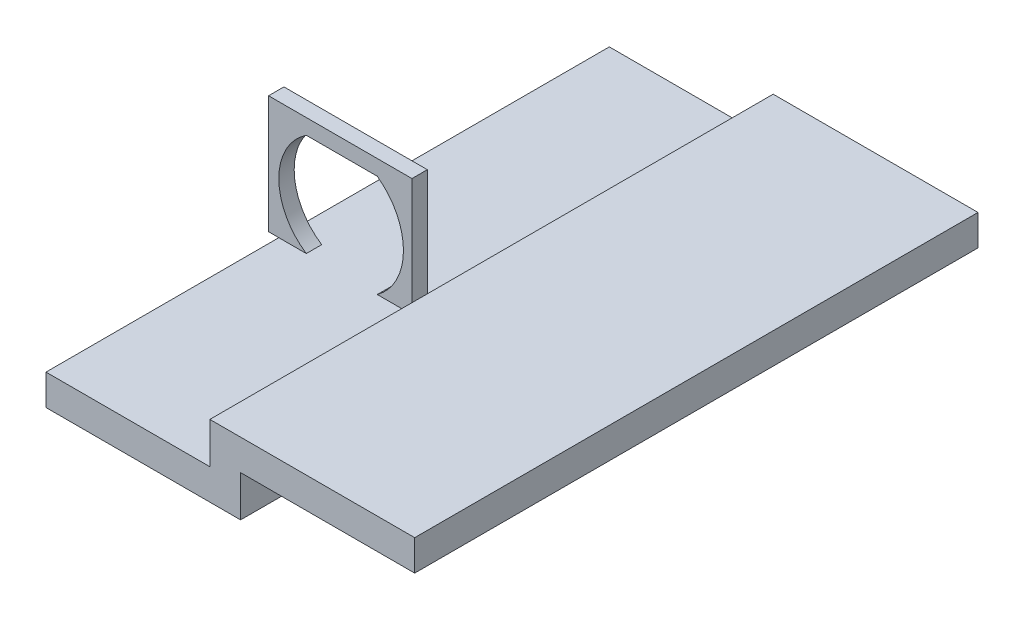
ISO-10303-21;
HEADER;
FILE_DESCRIPTION(('STEP AP214'),'2;1');
FILE_NAME('part.step','',(''),(''),'','','');
FILE_SCHEMA(('AUTOMOTIVE_DESIGN { 1 0 10303 214 1 1 1 1 }'));
ENDSEC;
DATA;
#1=APPLICATION_CONTEXT('core data for automotive mechanical design processes');
#2=APPLICATION_PROTOCOL_DEFINITION('international standard','automotive_design',2000,#1);
#3=PRODUCT_CONTEXT('',#1,'mechanical');
#4=PRODUCT('Part','Part','',(#3));
#5=PRODUCT_RELATED_PRODUCT_CATEGORY('part','',(#4));
#6=PRODUCT_DEFINITION_FORMATION('','',#4);
#7=PRODUCT_DEFINITION_CONTEXT('part definition',#1,'design');
#8=PRODUCT_DEFINITION('design','',#6,#7);
#9=PRODUCT_DEFINITION_SHAPE('','',#8);
#10=(LENGTH_UNIT() NAMED_UNIT(*) SI_UNIT(.MILLI.,.METRE.));
#11=(NAMED_UNIT(*) PLANE_ANGLE_UNIT() SI_UNIT($,.RADIAN.));
#12=(NAMED_UNIT(*) SI_UNIT($,.STERADIAN.) SOLID_ANGLE_UNIT());
#13=UNCERTAINTY_MEASURE_WITH_UNIT(LENGTH_MEASURE(1.E-05),#10,'distance_accuracy_value','');
#14=(GEOMETRIC_REPRESENTATION_CONTEXT(3) GLOBAL_UNCERTAINTY_ASSIGNED_CONTEXT((#13)) GLOBAL_UNIT_ASSIGNED_CONTEXT((#10,
#11,#12)) REPRESENTATION_CONTEXT('',''));
#15=CARTESIAN_POINT('',(0.,0.,0.));
#16=DIRECTION('',(0.,0.,1.));
#17=DIRECTION('',(1.,0.,0.));
#18=AXIS2_PLACEMENT_3D('',#15,#16,#17);
#19=CARTESIAN_POINT('',(-3.,3.,55.));
#20=DIRECTION('',(0.,-1.,0.));
#21=DIRECTION('',(1.,0.,0.));
#22=AXIS2_PLACEMENT_3D('',#19,#20,#21);
#23=PLANE('',#22);
#24=DIRECTION('',(0.,0.,1.));
#25=VECTOR('',#24,1.);
#26=CARTESIAN_POINT('',(-9.38702330984164,2.99999999999999,20.7679651385859));
#27=LINE('',#26,#25);
#28=CARTESIAN_POINT('',(-9.38702330984164,2.99999999999999,30.7679651385859));
#29=VERTEX_POINT('',#28);
#30=CARTESIAN_POINT('',(-9.38702330984164,2.99999999999999,32.2679651385859));
#31=VERTEX_POINT('',#30);
#32=EDGE_CURVE('E172',#29,#31,#27,.T.);
#33=ORIENTED_EDGE('',*,*,#32,.F.);
#34=DIRECTION('',(-1.,0.,0.));
#35=VECTOR('',#34,1.);
#36=CARTESIAN_POINT('',(-6.,3.,30.7679651385859));
#37=LINE('',#36,#35);
#38=CARTESIAN_POINT('',(-6.,3.,30.7679651385859));
#39=VERTEX_POINT('',#38);
#40=EDGE_CURVE('E193',#39,#29,#37,.T.);
#41=ORIENTED_EDGE('',*,*,#40,.F.);
#42=DIRECTION('',(0.,0.,-1.));
#43=VECTOR('',#42,1.);
#44=CARTESIAN_POINT('',(-6.,3.,32.2679651385859));
#45=LINE('',#44,#43);
#46=CARTESIAN_POINT('',(-6.,3.,32.2679651385859));
#47=VERTEX_POINT('',#46);
#48=EDGE_CURVE('E186',#47,#39,#45,.T.);
#49=ORIENTED_EDGE('',*,*,#48,.F.);
#50=DIRECTION('',(1.,0.,0.));
#51=VECTOR('',#50,1.);
#52=CARTESIAN_POINT('',(-3.,3.,32.2679651385859));
#53=LINE('',#52,#51);
#54=EDGE_CURVE('E41',#31,#47,#53,.T.);
#55=ORIENTED_EDGE('',*,*,#54,.F.);
#56=EDGE_LOOP('',(#33,#41,#49,#55));
#57=FACE_BOUND('',#56,.T.);
#58=CARTESIAN_POINT('',(-16.3166247903554,2.99999999999999,30.7679651385859));
#59=VERTEX_POINT('',#58);
#60=CARTESIAN_POINT('',(-19.,2.99999999999999,30.7679651385859));
#61=VERTEX_POINT('',#60);
#62=EDGE_CURVE('E197',#59,#61,#37,.T.);
#63=ORIENTED_EDGE('',*,*,#62,.F.);
#64=DIRECTION('',(0.,0.,1.));
#65=VECTOR('',#64,1.);
#66=CARTESIAN_POINT('',(-16.3166247903554,2.99999999999999,20.7679651385859));
#67=LINE('',#66,#65);
#68=CARTESIAN_POINT('',(-16.3166247903554,2.99999999999999,32.2679651385859));
#69=VERTEX_POINT('',#68);
#70=EDGE_CURVE('E158',#59,#69,#67,.T.);
#71=ORIENTED_EDGE('',*,*,#70,.T.);
#72=CARTESIAN_POINT('',(-19.,2.99999999999999,32.2679651385859));
#73=VERTEX_POINT('',#72);
#74=EDGE_CURVE('E11',#73,#69,#53,.T.);
#75=ORIENTED_EDGE('',*,*,#74,.F.);
#76=DIRECTION('',(0.,0.,-1.));
#77=VECTOR('',#76,1.);
#78=CARTESIAN_POINT('',(-19.,2.99999999999999,55.));
#79=LINE('',#78,#77);
#80=CARTESIAN_POINT('',(-19.,2.99999999999999,55.));
#81=VERTEX_POINT('',#80);
#82=EDGE_CURVE('E250',#81,#73,#79,.T.);
#83=ORIENTED_EDGE('',*,*,#82,.F.);
#84=DIRECTION('',(-1.,0.,0.));
#85=VECTOR('',#84,1.);
#86=CARTESIAN_POINT('',(-3.,3.,55.));
#87=LINE('',#86,#85);
#88=CARTESIAN_POINT('',(-3.,3.,55.));
#89=VERTEX_POINT('',#88);
#90=EDGE_CURVE('E231',#89,#81,#87,.T.);
#91=ORIENTED_EDGE('',*,*,#90,.F.);
#92=DIRECTION('',(0.,0.,-1.));
#93=VECTOR('',#92,1.);
#94=CARTESIAN_POINT('',(-3.,3.,55.));
#95=LINE('',#94,#93);
#96=CARTESIAN_POINT('',(-3.,3.,0.));
#97=VERTEX_POINT('',#96);
#98=EDGE_CURVE('E253',#89,#97,#95,.T.);
#99=ORIENTED_EDGE('',*,*,#98,.T.);
#100=DIRECTION('',(-1.,0.,0.));
#101=VECTOR('',#100,1.);
#102=CARTESIAN_POINT('',(-3.,3.,0.));
#103=LINE('',#102,#101);
#104=CARTESIAN_POINT('',(-19.,2.99999999999999,0.));
#105=VERTEX_POINT('',#104);
#106=EDGE_CURVE('E219',#97,#105,#103,.T.);
#107=ORIENTED_EDGE('',*,*,#106,.T.);
#108=EDGE_CURVE('E233',#61,#105,#79,.T.);
#109=ORIENTED_EDGE('',*,*,#108,.F.);
#110=EDGE_LOOP('',(#63,#71,#75,#83,#91,#99,#107,#109));
#111=FACE_BOUND('',#110,.T.);
#112=ADVANCED_FACE('F33',(#57,#111),#23,.F.);
#113=CARTESIAN_POINT('',(-19.,2.99999999999999,55.));
#114=DIRECTION('',(1.,0.,0.));
#115=DIRECTION('',(0.,0.,-1.));
#116=AXIS2_PLACEMENT_3D('',#113,#114,#115);
#117=PLANE('',#116);
#118=DIRECTION('',(0.,-1.,0.));
#119=VECTOR('',#118,1.);
#120=CARTESIAN_POINT('',(-19.,2.99999999999999,0.));
#121=LINE('',#120,#119);
#122=CARTESIAN_POINT('',(-19.,0.,0.));
#123=VERTEX_POINT('',#122);
#124=EDGE_CURVE('E214',#105,#123,#121,.T.);
#125=ORIENTED_EDGE('',*,*,#124,.T.);
#126=DIRECTION('',(0.,0.,-1.));
#127=VECTOR('',#126,1.);
#128=CARTESIAN_POINT('',(-19.,0.,55.));
#129=LINE('',#128,#127);
#130=CARTESIAN_POINT('',(-19.,0.,55.));
#131=VERTEX_POINT('',#130);
#132=EDGE_CURVE('E271',#131,#123,#129,.T.);
#133=ORIENTED_EDGE('',*,*,#132,.F.);
#134=DIRECTION('',(0.,-1.,0.));
#135=VECTOR('',#134,1.);
#136=CARTESIAN_POINT('',(-19.,2.99999999999999,55.));
#137=LINE('',#136,#135);
#138=EDGE_CURVE('E215',#81,#131,#137,.T.);
#139=ORIENTED_EDGE('',*,*,#138,.F.);
#140=ORIENTED_EDGE('',*,*,#82,.T.);
#141=EDGE_CURVE('E254',#73,#61,#79,.T.);
#142=ORIENTED_EDGE('',*,*,#141,.T.);
#143=ORIENTED_EDGE('',*,*,#108,.T.);
#144=EDGE_LOOP('',(#125,#133,#139,#140,#142,#143));
#145=FACE_BOUND('',#144,.T.);
#146=ADVANCED_FACE('F35',(#145),#117,.F.);
#147=CARTESIAN_POINT('',(-19.,0.,55.));
#148=DIRECTION('',(0.,1.,0.));
#149=DIRECTION('',(-1.,0.,0.));
#150=AXIS2_PLACEMENT_3D('',#147,#148,#149);
#151=PLANE('',#150);
#152=DIRECTION('',(1.,0.,0.));
#153=VECTOR('',#152,1.);
#154=CARTESIAN_POINT('',(-19.,0.,0.));
#155=LINE('',#154,#153);
#156=CARTESIAN_POINT('',(0.,0.,0.));
#157=VERTEX_POINT('',#156);
#158=EDGE_CURVE('E236',#123,#157,#155,.T.);
#159=ORIENTED_EDGE('',*,*,#158,.T.);
#160=DIRECTION('',(0.,0.,-1.));
#161=VECTOR('',#160,1.);
#162=CARTESIAN_POINT('',(0.,0.,55.));
#163=LINE('',#162,#161);
#164=CARTESIAN_POINT('',(0.,0.,55.));
#165=VERTEX_POINT('',#164);
#166=EDGE_CURVE('E269',#165,#157,#163,.T.);
#167=ORIENTED_EDGE('',*,*,#166,.F.);
#168=DIRECTION('',(1.,0.,0.));
#169=VECTOR('',#168,1.);
#170=CARTESIAN_POINT('',(-19.,0.,55.));
#171=LINE('',#170,#169);
#172=EDGE_CURVE('E218',#131,#165,#171,.T.);
#173=ORIENTED_EDGE('',*,*,#172,.F.);
#174=ORIENTED_EDGE('',*,*,#132,.T.);
#175=EDGE_LOOP('',(#159,#167,#173,#174));
#176=FACE_BOUND('',#175,.T.);
#177=ADVANCED_FACE('F312',(#176),#151,.F.);
#178=CARTESIAN_POINT('',(0.,0.,55.));
#179=DIRECTION('',(-1.,0.,0.));
#180=DIRECTION('',(0.,0.,1.));
#181=AXIS2_PLACEMENT_3D('',#178,#179,#180);
#182=PLANE('',#181);
#183=DIRECTION('',(0.,1.,0.));
#184=VECTOR('',#183,1.);
#185=CARTESIAN_POINT('',(0.,0.,0.));
#186=LINE('',#185,#184);
#187=CARTESIAN_POINT('',(0.,4.,0.));
#188=VERTEX_POINT('',#187);
#189=EDGE_CURVE('E238',#157,#188,#186,.T.);
#190=ORIENTED_EDGE('',*,*,#189,.T.);
#191=DIRECTION('',(0.,0.,-1.));
#192=VECTOR('',#191,1.);
#193=CARTESIAN_POINT('',(0.,4.,55.));
#194=LINE('',#193,#192);
#195=CARTESIAN_POINT('',(0.,4.,55.));
#196=VERTEX_POINT('',#195);
#197=EDGE_CURVE('E266',#196,#188,#194,.T.);
#198=ORIENTED_EDGE('',*,*,#197,.F.);
#199=DIRECTION('',(0.,1.,0.));
#200=VECTOR('',#199,1.);
#201=CARTESIAN_POINT('',(0.,0.,55.));
#202=LINE('',#201,#200);
#203=EDGE_CURVE('E221',#165,#196,#202,.T.);
#204=ORIENTED_EDGE('',*,*,#203,.F.);
#205=ORIENTED_EDGE('',*,*,#166,.T.);
#206=EDGE_LOOP('',(#190,#198,#204,#205));
#207=FACE_BOUND('',#206,.T.);
#208=ADVANCED_FACE('F315',(#207),#182,.F.);
#209=CARTESIAN_POINT('',(0.,4.,55.));
#210=DIRECTION('',(0.,1.,0.));
#211=DIRECTION('',(0.,0.,1.));
#212=AXIS2_PLACEMENT_3D('',#209,#210,#211);
#213=PLANE('',#212);
#214=DIRECTION('',(1.,0.,0.));
#215=VECTOR('',#214,1.);
#216=CARTESIAN_POINT('',(0.,4.,0.));
#217=LINE('',#216,#215);
#218=CARTESIAN_POINT('',(17.,4.,0.));
#219=VERTEX_POINT('',#218);
#220=EDGE_CURVE('E240',#188,#219,#217,.T.);
#221=ORIENTED_EDGE('',*,*,#220,.T.);
#222=DIRECTION('',(0.,0.,-1.));
#223=VECTOR('',#222,1.);
#224=CARTESIAN_POINT('',(17.,4.,55.));
#225=LINE('',#224,#223);
#226=CARTESIAN_POINT('',(17.,4.,55.));
#227=VERTEX_POINT('',#226);
#228=EDGE_CURVE('E263',#227,#219,#225,.T.);
#229=ORIENTED_EDGE('',*,*,#228,.F.);
#230=DIRECTION('',(1.,0.,0.));
#231=VECTOR('',#230,1.);
#232=CARTESIAN_POINT('',(0.,4.,55.));
#233=LINE('',#232,#231);
#234=EDGE_CURVE('E223',#196,#227,#233,.T.);
#235=ORIENTED_EDGE('',*,*,#234,.F.);
#236=ORIENTED_EDGE('',*,*,#197,.T.);
#237=EDGE_LOOP('',(#221,#229,#235,#236));
#238=FACE_BOUND('',#237,.T.);
#239=ADVANCED_FACE('F356',(#238),#213,.F.);
#240=CARTESIAN_POINT('',(17.,4.,55.));
#241=DIRECTION('',(-1.,0.,0.));
#242=DIRECTION('',(0.,0.,1.));
#243=AXIS2_PLACEMENT_3D('',#240,#241,#242);
#244=PLANE('',#243);
#245=DIRECTION('',(0.,1.,0.));
#246=VECTOR('',#245,1.);
#247=CARTESIAN_POINT('',(17.,4.,0.));
#248=LINE('',#247,#246);
#249=CARTESIAN_POINT('',(17.,7.,0.));
#250=VERTEX_POINT('',#249);
#251=EDGE_CURVE('E242',#219,#250,#248,.T.);
#252=ORIENTED_EDGE('',*,*,#251,.T.);
#253=DIRECTION('',(0.,0.,-1.));
#254=VECTOR('',#253,1.);
#255=CARTESIAN_POINT('',(17.,7.,55.));
#256=LINE('',#255,#254);
#257=CARTESIAN_POINT('',(17.,7.,55.));
#258=VERTEX_POINT('',#257);
#259=EDGE_CURVE('E260',#258,#250,#256,.T.);
#260=ORIENTED_EDGE('',*,*,#259,.F.);
#261=DIRECTION('',(0.,1.,0.));
#262=VECTOR('',#261,1.);
#263=CARTESIAN_POINT('',(17.,4.,55.));
#264=LINE('',#263,#262);
#265=EDGE_CURVE('E225',#227,#258,#264,.T.);
#266=ORIENTED_EDGE('',*,*,#265,.F.);
#267=ORIENTED_EDGE('',*,*,#228,.T.);
#268=EDGE_LOOP('',(#252,#260,#266,#267));
#269=FACE_BOUND('',#268,.T.);
#270=ADVANCED_FACE('F352',(#269),#244,.F.);
#271=CARTESIAN_POINT('',(17.,7.,55.));
#272=DIRECTION('',(0.,-1.,0.));
#273=DIRECTION('',(1.,0.,0.));
#274=AXIS2_PLACEMENT_3D('',#271,#272,#273);
#275=PLANE('',#274);
#276=DIRECTION('',(-1.,0.,0.));
#277=VECTOR('',#276,1.);
#278=CARTESIAN_POINT('',(17.,7.,0.));
#279=LINE('',#278,#277);
#280=CARTESIAN_POINT('',(-3.,7.,0.));
#281=VERTEX_POINT('',#280);
#282=EDGE_CURVE('E244',#250,#281,#279,.T.);
#283=ORIENTED_EDGE('',*,*,#282,.T.);
#284=DIRECTION('',(0.,0.,-1.));
#285=VECTOR('',#284,1.);
#286=CARTESIAN_POINT('',(-3.,7.,55.));
#287=LINE('',#286,#285);
#288=CARTESIAN_POINT('',(-3.,7.,55.));
#289=VERTEX_POINT('',#288);
#290=EDGE_CURVE('E257',#289,#281,#287,.T.);
#291=ORIENTED_EDGE('',*,*,#290,.F.);
#292=DIRECTION('',(-1.,0.,0.));
#293=VECTOR('',#292,1.);
#294=CARTESIAN_POINT('',(17.,7.,55.));
#295=LINE('',#294,#293);
#296=EDGE_CURVE('E227',#258,#289,#295,.T.);
#297=ORIENTED_EDGE('',*,*,#296,.F.);
#298=ORIENTED_EDGE('',*,*,#259,.T.);
#299=EDGE_LOOP('',(#283,#291,#297,#298));
#300=FACE_BOUND('',#299,.T.);
#301=ADVANCED_FACE('F348',(#300),#275,.F.);
#302=CARTESIAN_POINT('',(-3.,7.,55.));
#303=DIRECTION('',(1.,0.,0.));
#304=DIRECTION('',(0.,1.,0.));
#305=AXIS2_PLACEMENT_3D('',#302,#303,#304);
#306=PLANE('',#305);
#307=DIRECTION('',(0.,-1.,0.));
#308=VECTOR('',#307,1.);
#309=CARTESIAN_POINT('',(-3.,7.,0.));
#310=LINE('',#309,#308);
#311=EDGE_CURVE('E246',#281,#97,#310,.T.);
#312=ORIENTED_EDGE('',*,*,#311,.T.);
#313=ORIENTED_EDGE('',*,*,#98,.F.);
#314=DIRECTION('',(0.,-1.,0.));
#315=VECTOR('',#314,1.);
#316=CARTESIAN_POINT('',(-3.,7.,55.));
#317=LINE('',#316,#315);
#318=EDGE_CURVE('E229',#289,#89,#317,.T.);
#319=ORIENTED_EDGE('',*,*,#318,.F.);
#320=ORIENTED_EDGE('',*,*,#290,.T.);
#321=EDGE_LOOP('',(#312,#313,#319,#320));
#322=FACE_BOUND('',#321,.T.);
#323=ADVANCED_FACE('F345',(#322),#306,.F.);
#324=CARTESIAN_POINT('',(0.,0.,55.));
#325=DIRECTION('',(0.,0.,1.));
#326=DIRECTION('',(1.,0.,0.));
#327=AXIS2_PLACEMENT_3D('',#324,#325,#326);
#328=PLANE('',#327);
#329=ORIENTED_EDGE('',*,*,#138,.T.);
#330=ORIENTED_EDGE('',*,*,#172,.T.);
#331=ORIENTED_EDGE('',*,*,#203,.T.);
#332=ORIENTED_EDGE('',*,*,#234,.T.);
#333=ORIENTED_EDGE('',*,*,#265,.T.);
#334=ORIENTED_EDGE('',*,*,#296,.T.);
#335=ORIENTED_EDGE('',*,*,#318,.T.);
#336=ORIENTED_EDGE('',*,*,#90,.T.);
#337=EDGE_LOOP('',(#329,#330,#331,#332,#333,#334,#335,#336));
#338=FACE_BOUND('',#337,.T.);
#339=ADVANCED_FACE('F319',(#338),#328,.T.);
#340=CARTESIAN_POINT('',(0.,0.,0.));
#341=DIRECTION('',(0.,0.,1.));
#342=DIRECTION('',(1.,0.,0.));
#343=AXIS2_PLACEMENT_3D('',#340,#341,#342);
#344=PLANE('',#343);
#345=ORIENTED_EDGE('',*,*,#124,.F.);
#346=ORIENTED_EDGE('',*,*,#106,.F.);
#347=ORIENTED_EDGE('',*,*,#311,.F.);
#348=ORIENTED_EDGE('',*,*,#282,.F.);
#349=ORIENTED_EDGE('',*,*,#251,.F.);
#350=ORIENTED_EDGE('',*,*,#220,.F.);
#351=ORIENTED_EDGE('',*,*,#189,.F.);
#352=ORIENTED_EDGE('',*,*,#158,.F.);
#353=EDGE_LOOP('',(#345,#346,#347,#348,#349,#350,#351,#352));
#354=FACE_BOUND('',#353,.T.);
#355=ADVANCED_FACE('F308',(#354),#344,.F.);
#356=CARTESIAN_POINT('',(0.,3.,0.));
#357=DIRECTION('',(0.,1.,0.));
#358=DIRECTION('',(-1.,0.,0.));
#359=AXIS2_PLACEMENT_3D('',#356,#357,#358);
#360=PLANE('',#359);
#361=CARTESIAN_POINT('',(-20.,2.99999999999999,30.7679651385859));
#362=VERTEX_POINT('',#361);
#363=EDGE_CURVE('E181',#61,#362,#37,.T.);
#364=ORIENTED_EDGE('',*,*,#363,.F.);
#365=ORIENTED_EDGE('',*,*,#141,.F.);
#366=DIRECTION('',(1.,0.,0.));
#367=VECTOR('',#366,1.);
#368=CARTESIAN_POINT('',(-20.,2.99999999999999,32.2679651385859));
#369=LINE('',#368,#367);
#370=CARTESIAN_POINT('',(-20.,2.99999999999999,32.2679651385859));
#371=VERTEX_POINT('',#370);
#372=EDGE_CURVE('E199',#371,#73,#369,.T.);
#373=ORIENTED_EDGE('',*,*,#372,.F.);
#374=DIRECTION('',(0.,0.,1.));
#375=VECTOR('',#374,1.);
#376=CARTESIAN_POINT('',(-20.,2.99999999999999,30.7679651385859));
#377=LINE('',#376,#375);
#378=EDGE_CURVE('E196',#362,#371,#377,.T.);
#379=ORIENTED_EDGE('',*,*,#378,.F.);
#380=EDGE_LOOP('',(#364,#365,#373,#379));
#381=FACE_BOUND('',#380,.T.);
#382=ADVANCED_FACE('F297',(#381),#360,.F.);
#383=CARTESIAN_POINT('',(-6.00000000000001,14.5,30.7679651385859));
#384=DIRECTION('',(0.,0.,1.));
#385=DIRECTION('',(1.,0.,0.));
#386=AXIS2_PLACEMENT_3D('',#383,#384,#385);
#387=PLANE('',#386);
#388=ORIENTED_EDGE('',*,*,#40,.T.);
#389=CARTESIAN_POINT('',(-13.,8.,30.7679651385859));
#390=DIRECTION('',(0.,0.,1.));
#391=DIRECTION('',(1.,0.,0.));
#392=AXIS2_PLACEMENT_3D('',#389,#390,#391);
#393=CIRCLE('',#392,6.16876005074178);
#394=CARTESIAN_POINT('',(-9.38702330984163,13.,30.7679651385859));
#395=VERTEX_POINT('',#394);
#396=EDGE_CURVE('E178',#29,#395,#393,.T.);
#397=ORIENTED_EDGE('',*,*,#396,.T.);
#398=DIRECTION('',(-1.,0.,0.));
#399=VECTOR('',#398,1.);
#400=CARTESIAN_POINT('',(-6.00000000000001,13.,30.7679651385859));
#401=LINE('',#400,#399);
#402=CARTESIAN_POINT('',(-16.3166247903554,13.,30.7679651385859));
#403=VERTEX_POINT('',#402);
#404=EDGE_CURVE('E174',#395,#403,#401,.T.);
#405=ORIENTED_EDGE('',*,*,#404,.T.);
#406=CARTESIAN_POINT('',(-13.,8.,30.7679651385859));
#407=DIRECTION('',(0.,0.,1.));
#408=DIRECTION('',(1.,0.,0.));
#409=AXIS2_PLACEMENT_3D('',#406,#407,#408);
#410=CIRCLE('',#409,6.);
#411=EDGE_CURVE('E156',#403,#59,#410,.T.);
#412=ORIENTED_EDGE('',*,*,#411,.T.);
#413=ORIENTED_EDGE('',*,*,#62,.T.);
#414=ORIENTED_EDGE('',*,*,#363,.T.);
#415=DIRECTION('',(0.,-1.,0.));
#416=VECTOR('',#415,1.);
#417=CARTESIAN_POINT('',(-20.,14.5,30.7679651385859));
#418=LINE('',#417,#416);
#419=CARTESIAN_POINT('',(-20.,14.5,30.7679651385859));
#420=VERTEX_POINT('',#419);
#421=EDGE_CURVE('E211',#420,#362,#418,.T.);
#422=ORIENTED_EDGE('',*,*,#421,.F.);
#423=DIRECTION('',(-1.,0.,0.));
#424=VECTOR('',#423,1.);
#425=CARTESIAN_POINT('',(-6.00000000000001,14.5,30.7679651385859));
#426=LINE('',#425,#424);
#427=CARTESIAN_POINT('',(-6.00000000000001,14.5,30.7679651385859));
#428=VERTEX_POINT('',#427);
#429=EDGE_CURVE('E182',#428,#420,#426,.T.);
#430=ORIENTED_EDGE('',*,*,#429,.F.);
#431=DIRECTION('',(0.,-1.,0.));
#432=VECTOR('',#431,1.);
#433=CARTESIAN_POINT('',(-6.00000000000001,14.5,30.7679651385859));
#434=LINE('',#433,#432);
#435=EDGE_CURVE('E192',#428,#39,#434,.T.);
#436=ORIENTED_EDGE('',*,*,#435,.T.);
#437=EDGE_LOOP('',(#388,#397,#405,#412,#413,#414,#422,#430,#436));
#438=FACE_BOUND('',#437,.T.);
#439=ADVANCED_FACE('F324',(#438),#387,.F.);
#440=CARTESIAN_POINT('',(-20.,14.5,30.7679651385859));
#441=DIRECTION('',(1.,0.,0.));
#442=DIRECTION('',(0.,1.,0.));
#443=AXIS2_PLACEMENT_3D('',#440,#441,#442);
#444=PLANE('',#443);
#445=ORIENTED_EDGE('',*,*,#378,.T.);
#446=DIRECTION('',(0.,-1.,0.));
#447=VECTOR('',#446,1.);
#448=CARTESIAN_POINT('',(-20.,14.5,32.2679651385859));
#449=LINE('',#448,#447);
#450=CARTESIAN_POINT('',(-20.,14.5,32.2679651385859));
#451=VERTEX_POINT('',#450);
#452=EDGE_CURVE('E208',#451,#371,#449,.T.);
#453=ORIENTED_EDGE('',*,*,#452,.F.);
#454=DIRECTION('',(0.,0.,1.));
#455=VECTOR('',#454,1.);
#456=CARTESIAN_POINT('',(-20.,14.5,30.7679651385859));
#457=LINE('',#456,#455);
#458=EDGE_CURVE('E185',#420,#451,#457,.T.);
#459=ORIENTED_EDGE('',*,*,#458,.F.);
#460=ORIENTED_EDGE('',*,*,#421,.T.);
#461=EDGE_LOOP('',(#445,#453,#459,#460));
#462=FACE_BOUND('',#461,.T.);
#463=ADVANCED_FACE('F326',(#462),#444,.F.);
#464=CARTESIAN_POINT('',(-20.,14.5,32.2679651385859));
#465=DIRECTION('',(0.,0.,-1.));
#466=DIRECTION('',(-1.,0.,0.));
#467=AXIS2_PLACEMENT_3D('',#464,#465,#466);
#468=PLANE('',#467);
#469=DIRECTION('',(-1.,0.,0.));
#470=VECTOR('',#469,1.);
#471=CARTESIAN_POINT('',(-9.38702330984163,13.,32.2679651385859));
#472=LINE('',#471,#470);
#473=CARTESIAN_POINT('',(-9.38702330984163,13.,32.2679651385859));
#474=VERTEX_POINT('',#473);
#475=CARTESIAN_POINT('',(-16.3166247903554,13.,32.2679651385859));
#476=VERTEX_POINT('',#475);
#477=EDGE_CURVE('E162',#474,#476,#472,.T.);
#478=ORIENTED_EDGE('',*,*,#477,.F.);
#479=CARTESIAN_POINT('',(-13.,8.,32.2679651385859));
#480=DIRECTION('',(0.,0.,1.));
#481=DIRECTION('',(1.,0.,0.));
#482=AXIS2_PLACEMENT_3D('',#479,#480,#481);
#483=CIRCLE('',#482,6.16876005074178);
#484=EDGE_CURVE('E56',#31,#474,#483,.T.);
#485=ORIENTED_EDGE('',*,*,#484,.F.);
#486=ORIENTED_EDGE('',*,*,#54,.T.);
#487=DIRECTION('',(0.,-1.,0.));
#488=VECTOR('',#487,1.);
#489=CARTESIAN_POINT('',(-6.00000000000001,14.5,32.2679651385859));
#490=LINE('',#489,#488);
#491=CARTESIAN_POINT('',(-6.00000000000001,14.5,32.2679651385859));
#492=VERTEX_POINT('',#491);
#493=EDGE_CURVE('E205',#492,#47,#490,.T.);
#494=ORIENTED_EDGE('',*,*,#493,.F.);
#495=DIRECTION('',(1.,0.,0.));
#496=VECTOR('',#495,1.);
#497=CARTESIAN_POINT('',(-20.,14.5,32.2679651385859));
#498=LINE('',#497,#496);
#499=EDGE_CURVE('E188',#451,#492,#498,.T.);
#500=ORIENTED_EDGE('',*,*,#499,.F.);
#501=ORIENTED_EDGE('',*,*,#452,.T.);
#502=ORIENTED_EDGE('',*,*,#372,.T.);
#503=ORIENTED_EDGE('',*,*,#74,.T.);
#504=CARTESIAN_POINT('',(-13.,8.,32.2679651385859));
#505=DIRECTION('',(0.,0.,1.));
#506=DIRECTION('',(1.,0.,0.));
#507=AXIS2_PLACEMENT_3D('',#504,#505,#506);
#508=CIRCLE('',#507,6.);
#509=EDGE_CURVE('E154',#476,#69,#508,.T.);
#510=ORIENTED_EDGE('',*,*,#509,.F.);
#511=EDGE_LOOP('',(#478,#485,#486,#494,#500,#501,#502,#503,#510));
#512=FACE_BOUND('',#511,.T.);
#513=ADVANCED_FACE('F166',(#512),#468,.F.);
#514=CARTESIAN_POINT('',(-6.00000000000001,14.5,32.2679651385859));
#515=DIRECTION('',(-1.,0.,0.));
#516=DIRECTION('',(0.,-1.,0.));
#517=AXIS2_PLACEMENT_3D('',#514,#515,#516);
#518=PLANE('',#517);
#519=ORIENTED_EDGE('',*,*,#48,.T.);
#520=ORIENTED_EDGE('',*,*,#435,.F.);
#521=DIRECTION('',(0.,0.,-1.));
#522=VECTOR('',#521,1.);
#523=CARTESIAN_POINT('',(-6.00000000000001,14.5,32.2679651385859));
#524=LINE('',#523,#522);
#525=EDGE_CURVE('E190',#492,#428,#524,.T.);
#526=ORIENTED_EDGE('',*,*,#525,.F.);
#527=ORIENTED_EDGE('',*,*,#493,.T.);
#528=EDGE_LOOP('',(#519,#520,#526,#527));
#529=FACE_BOUND('',#528,.T.);
#530=ADVANCED_FACE('F285',(#529),#518,.F.);
#531=CARTESIAN_POINT('',(0.,14.5,0.));
#532=DIRECTION('',(0.,1.,0.));
#533=DIRECTION('',(-1.,0.,0.));
#534=AXIS2_PLACEMENT_3D('',#531,#532,#533);
#535=PLANE('',#534);
#536=ORIENTED_EDGE('',*,*,#429,.T.);
#537=ORIENTED_EDGE('',*,*,#458,.T.);
#538=ORIENTED_EDGE('',*,*,#499,.T.);
#539=ORIENTED_EDGE('',*,*,#525,.T.);
#540=EDGE_LOOP('',(#536,#537,#538,#539));
#541=FACE_BOUND('',#540,.T.);
#542=ADVANCED_FACE('F288',(#541),#535,.T.);
#543=CARTESIAN_POINT('',(-13.,8.,20.7679651385859));
#544=DIRECTION('',(0.,0.,1.));
#545=DIRECTION('',(1.,0.,0.));
#546=AXIS2_PLACEMENT_3D('',#543,#544,#545);
#547=CYLINDRICAL_SURFACE('',#546,6.16876005074178);
#548=ORIENTED_EDGE('',*,*,#32,.T.);
#549=ORIENTED_EDGE('',*,*,#484,.T.);
#550=DIRECTION('',(0.,0.,1.));
#551=VECTOR('',#550,1.);
#552=CARTESIAN_POINT('',(-9.38702330984163,13.,20.7679651385859));
#553=LINE('',#552,#551);
#554=EDGE_CURVE('E159',#395,#474,#553,.T.);
#555=ORIENTED_EDGE('',*,*,#554,.F.);
#556=ORIENTED_EDGE('',*,*,#396,.F.);
#557=EDGE_LOOP('',(#548,#549,#555,#556));
#558=FACE_BOUND('',#557,.T.);
#559=ADVANCED_FACE('F325',(#558),#547,.F.);
#560=CARTESIAN_POINT('',(-13.,8.,20.7679651385859));
#561=DIRECTION('',(0.,0.,1.));
#562=DIRECTION('',(1.,0.,0.));
#563=AXIS2_PLACEMENT_3D('',#560,#561,#562);
#564=CYLINDRICAL_SURFACE('',#563,6.);
#565=DIRECTION('',(0.,0.,1.));
#566=VECTOR('',#565,1.);
#567=CARTESIAN_POINT('',(-16.3166247903554,13.,20.7679651385859));
#568=LINE('',#567,#566);
#569=EDGE_CURVE('E48',#403,#476,#568,.T.);
#570=ORIENTED_EDGE('',*,*,#569,.T.);
#571=ORIENTED_EDGE('',*,*,#509,.T.);
#572=ORIENTED_EDGE('',*,*,#70,.F.);
#573=ORIENTED_EDGE('',*,*,#411,.F.);
#574=EDGE_LOOP('',(#570,#571,#572,#573));
#575=FACE_BOUND('',#574,.T.);
#576=ADVANCED_FACE('F152',(#575),#564,.F.);
#577=CARTESIAN_POINT('',(-9.38702330984163,13.,20.7679651385859));
#578=DIRECTION('',(0.,1.,0.));
#579=DIRECTION('',(-1.,0.,0.));
#580=AXIS2_PLACEMENT_3D('',#577,#578,#579);
#581=PLANE('',#580);
#582=ORIENTED_EDGE('',*,*,#554,.T.);
#583=ORIENTED_EDGE('',*,*,#477,.T.);
#584=ORIENTED_EDGE('',*,*,#569,.F.);
#585=ORIENTED_EDGE('',*,*,#404,.F.);
#586=EDGE_LOOP('',(#582,#583,#584,#585));
#587=FACE_BOUND('',#586,.T.);
#588=ADVANCED_FACE('F163',(#587),#581,.F.);
#589=CLOSED_SHELL('',(#112,#146,#177,#208,#239,#270,#301,#323,#339,#355,#382,#439,#463,#513,
#530,#542,#559,#576,#588));
#590=MANIFOLD_SOLID_BREP('B2',#589);
#591=ADVANCED_BREP_SHAPE_REPRESENTATION('',(#18,#590),#14);
#592=SHAPE_DEFINITION_REPRESENTATION(#9,#591);
ENDSEC;
END-ISO-10303-21;
